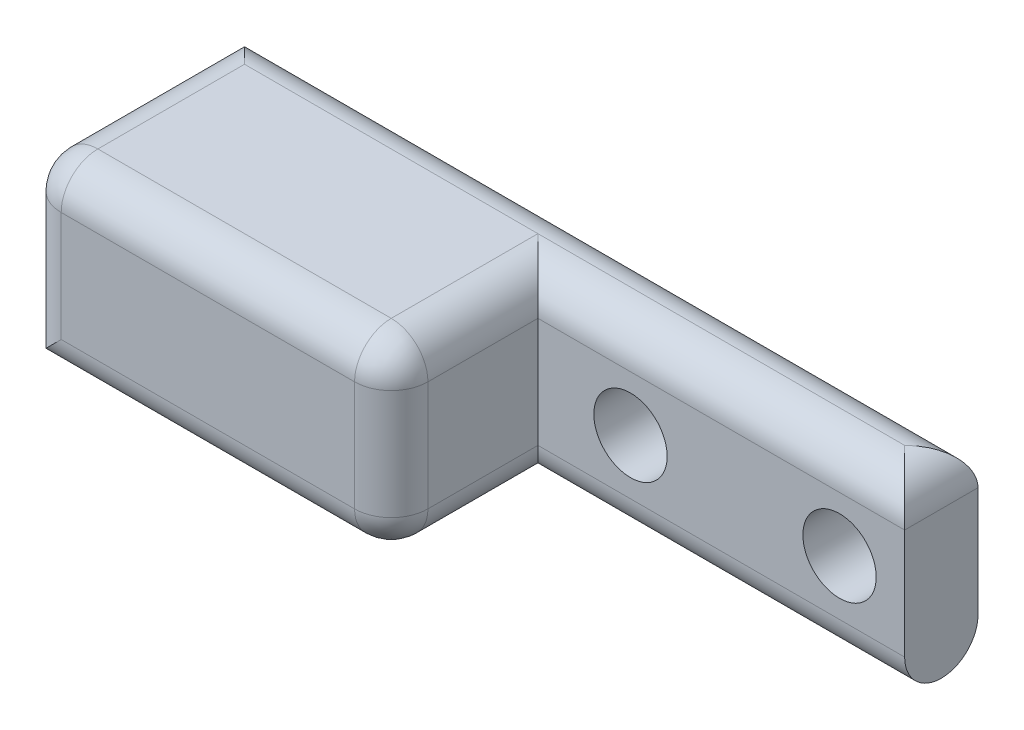
ISO-10303-21;
HEADER;
FILE_DESCRIPTION(('STEP AP214'),'2;1');
FILE_NAME('part.step','',(''),(''),'','','');
FILE_SCHEMA(('AUTOMOTIVE_DESIGN { 1 0 10303 214 1 1 1 1 }'));
ENDSEC;
DATA;
#1=APPLICATION_CONTEXT('core data for automotive mechanical design processes');
#2=APPLICATION_PROTOCOL_DEFINITION('international standard','automotive_design',2000,#1);
#3=PRODUCT_CONTEXT('',#1,'mechanical');
#4=PRODUCT('Part','Part','',(#3));
#5=PRODUCT_RELATED_PRODUCT_CATEGORY('part','',(#4));
#6=PRODUCT_DEFINITION_FORMATION('','',#4);
#7=PRODUCT_DEFINITION_CONTEXT('part definition',#1,'design');
#8=PRODUCT_DEFINITION('design','',#6,#7);
#9=PRODUCT_DEFINITION_SHAPE('','',#8);
#10=(LENGTH_UNIT() NAMED_UNIT(*) SI_UNIT(.MILLI.,.METRE.));
#11=(NAMED_UNIT(*) PLANE_ANGLE_UNIT() SI_UNIT($,.RADIAN.));
#12=(NAMED_UNIT(*) SI_UNIT($,.STERADIAN.) SOLID_ANGLE_UNIT());
#13=UNCERTAINTY_MEASURE_WITH_UNIT(LENGTH_MEASURE(1.E-05),#10,'distance_accuracy_value','');
#14=(GEOMETRIC_REPRESENTATION_CONTEXT(3) GLOBAL_UNCERTAINTY_ASSIGNED_CONTEXT((#13)) GLOBAL_UNIT_ASSIGNED_CONTEXT((#10,
#11,#12)) REPRESENTATION_CONTEXT('',''));
#15=CARTESIAN_POINT('',(0.,0.,0.));
#16=DIRECTION('',(0.,0.,1.));
#17=DIRECTION('',(1.,0.,0.));
#18=AXIS2_PLACEMENT_3D('',#15,#16,#17);
#19=CARTESIAN_POINT('',(10.,5.,0.));
#20=DIRECTION('',(0.,0.,-1.));
#21=DIRECTION('',(-1.,0.,0.));
#22=AXIS2_PLACEMENT_3D('',#19,#20,#21);
#23=PLANE('',#22);
#24=DIRECTION('',(0.,-1.,0.));
#25=VECTOR('',#24,1.);
#26=CARTESIAN_POINT('',(9.,5.,0.));
#27=LINE('',#26,#25);
#28=CARTESIAN_POINT('',(9.,1.,0.));
#29=VERTEX_POINT('',#28);
#30=CARTESIAN_POINT('',(9.,4.,0.));
#31=VERTEX_POINT('',#30);
#32=EDGE_CURVE('E300',#29,#31,#27,.F.);
#33=ORIENTED_EDGE('',*,*,#32,.T.);
#34=DIRECTION('',(1.,0.,0.));
#35=VECTOR('',#34,1.);
#36=CARTESIAN_POINT('',(10.,4.,0.));
#37=LINE('',#36,#35);
#38=CARTESIAN_POINT('',(0.999999999999999,4.,0.));
#39=VERTEX_POINT('',#38);
#40=EDGE_CURVE('E306',#31,#39,#37,.F.);
#41=ORIENTED_EDGE('',*,*,#40,.T.);
#42=DIRECTION('',(0.,-1.,0.));
#43=VECTOR('',#42,1.);
#44=CARTESIAN_POINT('',(0.999999999999999,5.,0.));
#45=LINE('',#44,#43);
#46=CARTESIAN_POINT('',(0.999999999999999,1.,0.));
#47=VERTEX_POINT('',#46);
#48=EDGE_CURVE('E303',#39,#47,#45,.T.);
#49=ORIENTED_EDGE('',*,*,#48,.T.);
#50=DIRECTION('',(1.,0.,0.));
#51=VECTOR('',#50,1.);
#52=CARTESIAN_POINT('',(10.,1.,0.));
#53=LINE('',#52,#51);
#54=EDGE_CURVE('E297',#47,#29,#53,.T.);
#55=ORIENTED_EDGE('',*,*,#54,.T.);
#56=EDGE_LOOP('',(#33,#41,#49,#55));
#57=FACE_BOUND('',#56,.T.);
#58=ADVANCED_FACE('F39',(#57),#23,.F.);
#59=CARTESIAN_POINT('',(10.,5.,-4.));
#60=DIRECTION('',(-1.,0.,0.));
#61=DIRECTION('',(0.,0.,1.));
#62=AXIS2_PLACEMENT_3D('',#59,#60,#61);
#63=PLANE('',#62);
#64=DIRECTION('',(0.,-1.,0.));
#65=VECTOR('',#64,1.);
#66=CARTESIAN_POINT('',(10.,5.,-4.));
#67=LINE('',#66,#65);
#68=CARTESIAN_POINT('',(10.,4.,-4.));
#69=VERTEX_POINT('',#68);
#70=CARTESIAN_POINT('',(10.,1.,-4.));
#71=VERTEX_POINT('',#70);
#72=EDGE_CURVE('E237',#69,#71,#67,.T.);
#73=ORIENTED_EDGE('',*,*,#72,.F.);
#74=DIRECTION('',(0.,0.,-1.));
#75=VECTOR('',#74,1.);
#76=CARTESIAN_POINT('',(10.,4.,-4.));
#77=LINE('',#76,#75);
#78=CARTESIAN_POINT('',(10.,4.,-0.999999999999999));
#79=VERTEX_POINT('',#78);
#80=EDGE_CURVE('E294',#69,#79,#77,.F.);
#81=ORIENTED_EDGE('',*,*,#80,.T.);
#82=DIRECTION('',(0.,-1.,0.));
#83=VECTOR('',#82,1.);
#84=CARTESIAN_POINT('',(10.,5.,-0.999999999999999));
#85=LINE('',#84,#83);
#86=CARTESIAN_POINT('',(10.,1.,-0.999999999999999));
#87=VERTEX_POINT('',#86);
#88=EDGE_CURVE('E291',#79,#87,#85,.T.);
#89=ORIENTED_EDGE('',*,*,#88,.T.);
#90=DIRECTION('',(0.,0.,-1.));
#91=VECTOR('',#90,1.);
#92=CARTESIAN_POINT('',(10.,1.,-4.));
#93=LINE('',#92,#91);
#94=EDGE_CURVE('E288',#87,#71,#93,.T.);
#95=ORIENTED_EDGE('',*,*,#94,.T.);
#96=EDGE_LOOP('',(#73,#81,#89,#95));
#97=FACE_BOUND('',#96,.T.);
#98=ADVANCED_FACE('F374',(#97),#63,.F.);
#99=CARTESIAN_POINT('',(10.,5.,-4.));
#100=DIRECTION('',(0.,0.,-1.));
#101=DIRECTION('',(-1.,0.,0.));
#102=AXIS2_PLACEMENT_3D('',#99,#100,#101);
#103=PLANE('',#102);
#104=CARTESIAN_POINT('',(12.523987240769,2.5,-4.));
#105=DIRECTION('',(0.,0.,1.));
#106=DIRECTION('',(1.,0.,0.));
#107=AXIS2_PLACEMENT_3D('',#104,#105,#106);
#108=CIRCLE('',#107,1.);
#109=CARTESIAN_POINT('',(13.523987240769,2.5,-4.));
#110=VERTEX_POINT('',#109);
#111=EDGE_CURVE('E211',#110,#110,#108,.T.);
#112=ORIENTED_EDGE('',*,*,#111,.F.);
#113=EDGE_LOOP('',(#112));
#114=FACE_BOUND('',#113,.T.);
#115=CARTESIAN_POINT('',(18.223987240769,2.5,-4.));
#116=DIRECTION('',(0.,0.,1.));
#117=DIRECTION('',(1.,0.,0.));
#118=AXIS2_PLACEMENT_3D('',#115,#116,#117);
#119=CIRCLE('',#118,1.);
#120=CARTESIAN_POINT('',(19.223987240769,2.5,-4.));
#121=VERTEX_POINT('',#120);
#122=EDGE_CURVE('E206',#121,#121,#119,.T.);
#123=ORIENTED_EDGE('',*,*,#122,.F.);
#124=EDGE_LOOP('',(#123));
#125=FACE_BOUND('',#124,.T.);
#126=DIRECTION('',(0.,-1.,0.));
#127=VECTOR('',#126,1.);
#128=CARTESIAN_POINT('',(20.,5.,-4.));
#129=LINE('',#128,#127);
#130=CARTESIAN_POINT('',(20.,4.,-4.));
#131=VERTEX_POINT('',#130);
#132=CARTESIAN_POINT('',(20.,1.,-4.));
#133=VERTEX_POINT('',#132);
#134=EDGE_CURVE('E233',#131,#133,#129,.T.);
#135=ORIENTED_EDGE('',*,*,#134,.F.);
#136=DIRECTION('',(1.,0.,0.));
#137=VECTOR('',#136,1.);
#138=CARTESIAN_POINT('',(10.,4.,-4.));
#139=LINE('',#138,#137);
#140=EDGE_CURVE('E143',#131,#69,#139,.F.);
#141=ORIENTED_EDGE('',*,*,#140,.T.);
#142=ORIENTED_EDGE('',*,*,#72,.T.);
#143=DIRECTION('',(1.,0.,0.));
#144=VECTOR('',#143,1.);
#145=CARTESIAN_POINT('',(20.,1.,-4.));
#146=LINE('',#145,#144);
#147=EDGE_CURVE('E283',#71,#133,#146,.T.);
#148=ORIENTED_EDGE('',*,*,#147,.T.);
#149=EDGE_LOOP('',(#135,#141,#142,#148));
#150=FACE_BOUND('',#149,.T.);
#151=ADVANCED_FACE('F378',(#114,#125,#150),#103,.F.);
#152=CARTESIAN_POINT('',(20.,5.,-6.));
#153=DIRECTION('',(-1.,0.,0.));
#154=DIRECTION('',(0.,0.,1.));
#155=AXIS2_PLACEMENT_3D('',#152,#153,#154);
#156=PLANE('',#155);
#157=DIRECTION('',(0.,-1.,0.));
#158=VECTOR('',#157,1.);
#159=CARTESIAN_POINT('',(20.,5.,-6.));
#160=LINE('',#159,#158);
#161=CARTESIAN_POINT('',(20.,4.,-6.));
#162=VERTEX_POINT('',#161);
#163=CARTESIAN_POINT('',(20.,1.,-6.));
#164=VERTEX_POINT('',#163);
#165=EDGE_CURVE('E229',#162,#164,#160,.T.);
#166=ORIENTED_EDGE('',*,*,#165,.F.);
#167=DIRECTION('',(0.,0.,-1.));
#168=VECTOR('',#167,1.);
#169=CARTESIAN_POINT('',(20.,4.,-6.));
#170=LINE('',#169,#168);
#171=EDGE_CURVE('E153',#162,#131,#170,.F.);
#172=ORIENTED_EDGE('',*,*,#171,.T.);
#173=ORIENTED_EDGE('',*,*,#134,.T.);
#174=CARTESIAN_POINT('',(20.,1.,-5.));
#175=DIRECTION('',(-1.,0.,0.));
#176=DIRECTION('',(0.,0.,1.));
#177=AXIS2_PLACEMENT_3D('',#174,#175,#176);
#178=CIRCLE('',#177,1.);
#179=CARTESIAN_POINT('',(20.,0.,-5.));
#180=VERTEX_POINT('',#179);
#181=EDGE_CURVE('E278',#133,#180,#178,.F.);
#182=ORIENTED_EDGE('',*,*,#181,.T.);
#183=CARTESIAN_POINT('',(20.,1.,-5.));
#184=DIRECTION('',(-1.,0.,0.));
#185=DIRECTION('',(0.,0.,1.));
#186=AXIS2_PLACEMENT_3D('',#183,#184,#185);
#187=CIRCLE('',#186,1.);
#188=EDGE_CURVE('E275',#180,#164,#187,.F.);
#189=ORIENTED_EDGE('',*,*,#188,.T.);
#190=EDGE_LOOP('',(#166,#172,#173,#182,#189));
#191=FACE_BOUND('',#190,.T.);
#192=ADVANCED_FACE('F381',(#191),#156,.F.);
#193=CARTESIAN_POINT('',(0.,5.,-6.));
#194=DIRECTION('',(0.,0.,1.));
#195=DIRECTION('',(1.,0.,0.));
#196=AXIS2_PLACEMENT_3D('',#193,#194,#195);
#197=PLANE('',#196);
#198=CARTESIAN_POINT('',(12.523987240769,2.5,-6.));
#199=DIRECTION('',(0.,0.,1.));
#200=DIRECTION('',(1.,0.,0.));
#201=AXIS2_PLACEMENT_3D('',#198,#199,#200);
#202=CIRCLE('',#201,1.);
#203=CARTESIAN_POINT('',(13.523987240769,2.5,-6.));
#204=VERTEX_POINT('',#203);
#205=EDGE_CURVE('E225',#204,#204,#202,.T.);
#206=ORIENTED_EDGE('',*,*,#205,.T.);
#207=EDGE_LOOP('',(#206));
#208=FACE_BOUND('',#207,.T.);
#209=CARTESIAN_POINT('',(18.223987240769,2.5,-6.));
#210=DIRECTION('',(0.,0.,1.));
#211=DIRECTION('',(1.,0.,0.));
#212=AXIS2_PLACEMENT_3D('',#209,#210,#211);
#213=CIRCLE('',#212,1.);
#214=CARTESIAN_POINT('',(19.223987240769,2.5,-6.));
#215=VERTEX_POINT('',#214);
#216=EDGE_CURVE('E217',#215,#215,#213,.T.);
#217=ORIENTED_EDGE('',*,*,#216,.T.);
#218=EDGE_LOOP('',(#217));
#219=FACE_BOUND('',#218,.T.);
#220=DIRECTION('',(0.,-1.,0.));
#221=VECTOR('',#220,1.);
#222=CARTESIAN_POINT('',(0.,5.,-6.));
#223=LINE('',#222,#221);
#224=CARTESIAN_POINT('',(0.,4.,-6.));
#225=VERTEX_POINT('',#224);
#226=CARTESIAN_POINT('',(0.,1.,-6.));
#227=VERTEX_POINT('',#226);
#228=EDGE_CURVE('E224',#225,#227,#223,.T.);
#229=ORIENTED_EDGE('',*,*,#228,.F.);
#230=DIRECTION('',(-1.,0.,0.));
#231=VECTOR('',#230,1.);
#232=CARTESIAN_POINT('',(0.,4.,-6.));
#233=LINE('',#232,#231);
#234=EDGE_CURVE('E272',#225,#162,#233,.F.);
#235=ORIENTED_EDGE('',*,*,#234,.T.);
#236=ORIENTED_EDGE('',*,*,#165,.T.);
#237=DIRECTION('',(-1.,0.,0.));
#238=VECTOR('',#237,1.);
#239=CARTESIAN_POINT('',(0.,1.,-6.));
#240=LINE('',#239,#238);
#241=EDGE_CURVE('E269',#164,#227,#240,.T.);
#242=ORIENTED_EDGE('',*,*,#241,.T.);
#243=EDGE_LOOP('',(#229,#235,#236,#242));
#244=FACE_BOUND('',#243,.T.);
#245=ADVANCED_FACE('F359',(#208,#219,#244),#197,.F.);
#246=CARTESIAN_POINT('',(0.,5.,0.));
#247=DIRECTION('',(1.,0.,0.));
#248=DIRECTION('',(0.,0.,-1.));
#249=AXIS2_PLACEMENT_3D('',#246,#247,#248);
#250=PLANE('',#249);
#251=DIRECTION('',(0.,-1.,0.));
#252=VECTOR('',#251,1.);
#253=CARTESIAN_POINT('',(0.,5.,-1.));
#254=LINE('',#253,#252);
#255=CARTESIAN_POINT('',(0.,0.,-1.));
#256=VERTEX_POINT('',#255);
#257=CARTESIAN_POINT('',(0.,4.,-1.));
#258=VERTEX_POINT('',#257);
#259=EDGE_CURVE('E262',#256,#258,#254,.F.);
#260=ORIENTED_EDGE('',*,*,#259,.T.);
#261=DIRECTION('',(0.,0.,1.));
#262=VECTOR('',#261,1.);
#263=CARTESIAN_POINT('',(0.,4.,0.));
#264=LINE('',#263,#262);
#265=EDGE_CURVE('E265',#258,#225,#264,.F.);
#266=ORIENTED_EDGE('',*,*,#265,.T.);
#267=ORIENTED_EDGE('',*,*,#228,.T.);
#268=CARTESIAN_POINT('',(0.,1.,-5.));
#269=DIRECTION('',(1.,0.,0.));
#270=DIRECTION('',(0.,0.,-1.));
#271=AXIS2_PLACEMENT_3D('',#268,#269,#270);
#272=CIRCLE('',#271,1.);
#273=CARTESIAN_POINT('',(0.,0.,-5.));
#274=VERTEX_POINT('',#273);
#275=EDGE_CURVE('E259',#227,#274,#272,.F.);
#276=ORIENTED_EDGE('',*,*,#275,.T.);
#277=DIRECTION('',(0.,0.,1.));
#278=VECTOR('',#277,1.);
#279=CARTESIAN_POINT('',(0.,0.,0.));
#280=LINE('',#279,#278);
#281=EDGE_CURVE('E220',#274,#256,#280,.T.);
#282=ORIENTED_EDGE('',*,*,#281,.T.);
#283=EDGE_LOOP('',(#260,#266,#267,#276,#282));
#284=FACE_BOUND('',#283,.T.);
#285=ADVANCED_FACE('F357',(#284),#250,.F.);
#286=CARTESIAN_POINT('',(0.,5.,0.));
#287=DIRECTION('',(0.,-1.,0.));
#288=DIRECTION('',(0.,0.,-1.));
#289=AXIS2_PLACEMENT_3D('',#286,#287,#288);
#290=PLANE('',#289);
#291=DIRECTION('',(-1.,0.,0.));
#292=VECTOR('',#291,1.);
#293=CARTESIAN_POINT('',(0.,5.,-5.));
#294=LINE('',#293,#292);
#295=CARTESIAN_POINT('',(9.,5.,-5.));
#296=VERTEX_POINT('',#295);
#297=CARTESIAN_POINT('',(1.,5.,-5.));
#298=VERTEX_POINT('',#297);
#299=EDGE_CURVE('E161',#296,#298,#294,.T.);
#300=ORIENTED_EDGE('',*,*,#299,.T.);
#301=DIRECTION('',(0.,0.,1.));
#302=VECTOR('',#301,1.);
#303=CARTESIAN_POINT('',(1.,5.,0.));
#304=LINE('',#303,#302);
#305=CARTESIAN_POINT('',(1.,5.,-1.));
#306=VERTEX_POINT('',#305);
#307=EDGE_CURVE('E255',#298,#306,#304,.T.);
#308=ORIENTED_EDGE('',*,*,#307,.T.);
#309=DIRECTION('',(1.,0.,0.));
#310=VECTOR('',#309,1.);
#311=CARTESIAN_POINT('',(0.,5.,-1.));
#312=LINE('',#311,#310);
#313=CARTESIAN_POINT('',(9.,5.,-0.999999999999999));
#314=VERTEX_POINT('',#313);
#315=EDGE_CURVE('E241',#306,#314,#312,.T.);
#316=ORIENTED_EDGE('',*,*,#315,.T.);
#317=DIRECTION('',(0.,0.,-1.));
#318=VECTOR('',#317,1.);
#319=CARTESIAN_POINT('',(9.,5.,0.));
#320=LINE('',#319,#318);
#321=EDGE_CURVE('E250',#314,#296,#320,.T.);
#322=ORIENTED_EDGE('',*,*,#321,.T.);
#323=EDGE_LOOP('',(#300,#308,#316,#322));
#324=FACE_BOUND('',#323,.T.);
#325=ADVANCED_FACE('F351',(#324),#290,.F.);
#326=CARTESIAN_POINT('',(0.,0.,0.));
#327=DIRECTION('',(0.,-1.,0.));
#328=DIRECTION('',(0.,0.,-1.));
#329=AXIS2_PLACEMENT_3D('',#326,#327,#328);
#330=PLANE('',#329);
#331=ORIENTED_EDGE('',*,*,#281,.F.);
#332=DIRECTION('',(-1.,0.,0.));
#333=VECTOR('',#332,1.);
#334=CARTESIAN_POINT('',(20.,0.,-5.));
#335=LINE('',#334,#333);
#336=CARTESIAN_POINT('',(9.,0.,-5.));
#337=VERTEX_POINT('',#336);
#338=EDGE_CURVE('E11',#274,#337,#335,.F.);
#339=ORIENTED_EDGE('',*,*,#338,.T.);
#340=DIRECTION('',(0.,0.,-1.));
#341=VECTOR('',#340,1.);
#342=CARTESIAN_POINT('',(9.,0.,0.));
#343=LINE('',#342,#341);
#344=CARTESIAN_POINT('',(9.,0.,-0.999999999999999));
#345=VERTEX_POINT('',#344);
#346=EDGE_CURVE('E50',#337,#345,#343,.F.);
#347=ORIENTED_EDGE('',*,*,#346,.T.);
#348=DIRECTION('',(1.,0.,0.));
#349=VECTOR('',#348,1.);
#350=CARTESIAN_POINT('',(0.,0.,-1.));
#351=LINE('',#350,#349);
#352=EDGE_CURVE('E310',#345,#256,#351,.F.);
#353=ORIENTED_EDGE('',*,*,#352,.T.);
#354=EDGE_LOOP('',(#331,#339,#347,#353));
#355=FACE_BOUND('',#354,.T.);
#356=ADVANCED_FACE('F363',(#355),#330,.T.);
#357=CARTESIAN_POINT('',(18.223987240769,2.5,-9.));
#358=DIRECTION('',(0.,0.,1.));
#359=DIRECTION('',(1.,0.,0.));
#360=AXIS2_PLACEMENT_3D('',#357,#358,#359);
#361=CYLINDRICAL_SURFACE('',#360,1.);
#362=ORIENTED_EDGE('',*,*,#122,.T.);
#363=EDGE_LOOP('',(#362));
#364=FACE_BOUND('',#363,.T.);
#365=ORIENTED_EDGE('',*,*,#216,.F.);
#366=EDGE_LOOP('',(#365));
#367=FACE_BOUND('',#366,.T.);
#368=ADVANCED_FACE('F432',(#364,#367),#361,.F.);
#369=CARTESIAN_POINT('',(12.523987240769,2.5,-9.));
#370=DIRECTION('',(0.,0.,1.));
#371=DIRECTION('',(1.,0.,0.));
#372=AXIS2_PLACEMENT_3D('',#369,#370,#371);
#373=CYLINDRICAL_SURFACE('',#372,1.);
#374=ORIENTED_EDGE('',*,*,#111,.T.);
#375=EDGE_LOOP('',(#374));
#376=FACE_BOUND('',#375,.T.);
#377=ORIENTED_EDGE('',*,*,#205,.F.);
#378=EDGE_LOOP('',(#377));
#379=FACE_BOUND('',#378,.T.);
#380=ADVANCED_FACE('F428',(#376,#379),#373,.F.);
#381=CARTESIAN_POINT('',(0.,1.,-5.));
#382=DIRECTION('',(1.,0.,0.));
#383=DIRECTION('',(0.,0.,-1.));
#384=AXIS2_PLACEMENT_3D('',#381,#382,#383);
#385=CYLINDRICAL_SURFACE('',#384,1.);
#386=ORIENTED_EDGE('',*,*,#241,.F.);
#387=ORIENTED_EDGE('',*,*,#188,.F.);
#388=DIRECTION('',(-1.,0.,0.));
#389=VECTOR('',#388,1.);
#390=CARTESIAN_POINT('',(20.,0.,-5.));
#391=LINE('',#390,#389);
#392=EDGE_CURVE('E43',#337,#180,#391,.F.);
#393=ORIENTED_EDGE('',*,*,#392,.F.);
#394=ORIENTED_EDGE('',*,*,#338,.F.);
#395=ORIENTED_EDGE('',*,*,#275,.F.);
#396=EDGE_LOOP('',(#386,#387,#393,#394,#395));
#397=FACE_BOUND('',#396,.T.);
#398=ADVANCED_FACE('F41',(#397),#385,.T.);
#399=CARTESIAN_POINT('',(10.,1.,-5.));
#400=DIRECTION('',(-1.,0.,0.));
#401=DIRECTION('',(0.,0.,1.));
#402=AXIS2_PLACEMENT_3D('',#399,#400,#401);
#403=CYLINDRICAL_SURFACE('',#402,1.);
#404=ORIENTED_EDGE('',*,*,#181,.F.);
#405=ORIENTED_EDGE('',*,*,#147,.F.);
#406=CARTESIAN_POINT('',(9.,1.,-5.));
#407=DIRECTION('',(-0.707106781186547,0.,0.707106781186547));
#408=DIRECTION('',(-0.707106781186547,0.,-0.707106781186547));
#409=AXIS2_PLACEMENT_3D('',#406,#407,#408);
#410=ELLIPSE('',#409,1.41421356237309,1.);
#411=EDGE_CURVE('E197',#337,#71,#410,.T.);
#412=ORIENTED_EDGE('',*,*,#411,.F.);
#413=ORIENTED_EDGE('',*,*,#392,.T.);
#414=EDGE_LOOP('',(#404,#405,#412,#413));
#415=FACE_BOUND('',#414,.T.);
#416=ADVANCED_FACE('F379',(#415),#403,.T.);
#417=CARTESIAN_POINT('',(9.,1.,-4.));
#418=DIRECTION('',(0.,0.,1.));
#419=DIRECTION('',(1.,0.,0.));
#420=AXIS2_PLACEMENT_3D('',#417,#418,#419);
#421=CYLINDRICAL_SURFACE('',#420,1.);
#422=ORIENTED_EDGE('',*,*,#411,.T.);
#423=ORIENTED_EDGE('',*,*,#94,.F.);
#424=CARTESIAN_POINT('',(9.,1.,-0.999999999999999));
#425=DIRECTION('',(0.,0.,1.));
#426=DIRECTION('',(1.,0.,0.));
#427=AXIS2_PLACEMENT_3D('',#424,#425,#426);
#428=CIRCLE('',#427,1.);
#429=EDGE_CURVE('E190',#345,#87,#428,.T.);
#430=ORIENTED_EDGE('',*,*,#429,.F.);
#431=ORIENTED_EDGE('',*,*,#346,.F.);
#432=EDGE_LOOP('',(#422,#423,#430,#431));
#433=FACE_BOUND('',#432,.T.);
#434=ADVANCED_FACE('F371',(#433),#421,.T.);
#435=CARTESIAN_POINT('',(9.,5.,-0.999999999999999));
#436=DIRECTION('',(0.,-1.,0.));
#437=DIRECTION('',(0.,0.,-1.));
#438=AXIS2_PLACEMENT_3D('',#435,#436,#437);
#439=CYLINDRICAL_SURFACE('',#438,1.);
#440=CARTESIAN_POINT('',(9.,1.,-0.999999999999999));
#441=DIRECTION('',(0.,-1.,0.));
#442=DIRECTION('',(0.,0.,-1.));
#443=AXIS2_PLACEMENT_3D('',#440,#441,#442);
#444=CIRCLE('',#443,1.);
#445=EDGE_CURVE('E194',#87,#29,#444,.T.);
#446=ORIENTED_EDGE('',*,*,#445,.F.);
#447=ORIENTED_EDGE('',*,*,#88,.F.);
#448=CARTESIAN_POINT('',(9.,4.,-0.999999999999999));
#449=DIRECTION('',(0.,1.,0.));
#450=DIRECTION('',(0.,0.,1.));
#451=AXIS2_PLACEMENT_3D('',#448,#449,#450);
#452=CIRCLE('',#451,1.);
#453=EDGE_CURVE('E182',#31,#79,#452,.T.);
#454=ORIENTED_EDGE('',*,*,#453,.F.);
#455=ORIENTED_EDGE('',*,*,#32,.F.);
#456=EDGE_LOOP('',(#446,#447,#454,#455));
#457=FACE_BOUND('',#456,.T.);
#458=ADVANCED_FACE('F341',(#457),#439,.T.);
#459=CARTESIAN_POINT('',(9.,1.,-0.999999999999999));
#460=DIRECTION('',(1.,0.,0.));
#461=DIRECTION('',(0.,0.,-1.));
#462=AXIS2_PLACEMENT_3D('',#459,#460,#461);
#463=SPHERICAL_SURFACE('',#462,1.);
#464=ORIENTED_EDGE('',*,*,#429,.T.);
#465=ORIENTED_EDGE('',*,*,#445,.T.);
#466=CARTESIAN_POINT('',(9.,1.,-0.999999999999999));
#467=DIRECTION('',(1.,0.,0.));
#468=DIRECTION('',(0.,0.,-1.));
#469=AXIS2_PLACEMENT_3D('',#466,#467,#468);
#470=CIRCLE('',#469,1.);
#471=EDGE_CURVE('E147',#345,#29,#470,.F.);
#472=ORIENTED_EDGE('',*,*,#471,.F.);
#473=EDGE_LOOP('',(#464,#465,#472));
#474=FACE_BOUND('',#473,.T.);
#475=ADVANCED_FACE('F370',(#474),#463,.T.);
#476=CARTESIAN_POINT('',(9.,4.,0.));
#477=DIRECTION('',(0.,0.,-1.));
#478=DIRECTION('',(-1.,0.,0.));
#479=AXIS2_PLACEMENT_3D('',#476,#477,#478);
#480=CYLINDRICAL_SURFACE('',#479,1.);
#481=CARTESIAN_POINT('',(9.,4.,-0.999999999999999));
#482=DIRECTION('',(0.,0.,1.));
#483=DIRECTION('',(1.,0.,0.));
#484=AXIS2_PLACEMENT_3D('',#481,#482,#483);
#485=CIRCLE('',#484,1.);
#486=EDGE_CURVE('E186',#79,#314,#485,.T.);
#487=ORIENTED_EDGE('',*,*,#486,.F.);
#488=ORIENTED_EDGE('',*,*,#80,.F.);
#489=CARTESIAN_POINT('',(9.,4.,-5.));
#490=DIRECTION('',(0.707106781186547,0.,-0.707106781186547));
#491=DIRECTION('',(0.707106781186547,0.,0.707106781186547));
#492=AXIS2_PLACEMENT_3D('',#489,#490,#491);
#493=ELLIPSE('',#492,1.41421356237309,1.);
#494=EDGE_CURVE('E148',#296,#69,#493,.T.);
#495=ORIENTED_EDGE('',*,*,#494,.F.);
#496=ORIENTED_EDGE('',*,*,#321,.F.);
#497=EDGE_LOOP('',(#487,#488,#495,#496));
#498=FACE_BOUND('',#497,.T.);
#499=ADVANCED_FACE('F348',(#498),#480,.T.);
#500=CARTESIAN_POINT('',(9.,4.,-0.999999999999999));
#501=DIRECTION('',(1.,0.,0.));
#502=DIRECTION('',(0.,0.,-1.));
#503=AXIS2_PLACEMENT_3D('',#500,#501,#502);
#504=SPHERICAL_SURFACE('',#503,1.);
#505=ORIENTED_EDGE('',*,*,#453,.T.);
#506=ORIENTED_EDGE('',*,*,#486,.T.);
#507=CARTESIAN_POINT('',(9.,4.,-0.999999999999999));
#508=DIRECTION('',(1.,0.,0.));
#509=DIRECTION('',(0.,0.,-1.));
#510=AXIS2_PLACEMENT_3D('',#507,#508,#509);
#511=CIRCLE('',#510,1.);
#512=EDGE_CURVE('E173',#31,#314,#511,.F.);
#513=ORIENTED_EDGE('',*,*,#512,.F.);
#514=EDGE_LOOP('',(#505,#506,#513));
#515=FACE_BOUND('',#514,.T.);
#516=ADVANCED_FACE('F344',(#515),#504,.T.);
#517=CARTESIAN_POINT('',(10.,1.,-0.999999999999999));
#518=DIRECTION('',(-1.,0.,0.));
#519=DIRECTION('',(0.,0.,1.));
#520=AXIS2_PLACEMENT_3D('',#517,#518,#519);
#521=CYLINDRICAL_SURFACE('',#520,1.);
#522=ORIENTED_EDGE('',*,*,#471,.T.);
#523=ORIENTED_EDGE('',*,*,#54,.F.);
#524=CARTESIAN_POINT('',(0.999999999999999,1.,-1.));
#525=DIRECTION('',(-0.707106781186547,0.707106781186547,0.));
#526=DIRECTION('',(-0.707106781186547,-0.707106781186547,0.));
#527=AXIS2_PLACEMENT_3D('',#524,#525,#526);
#528=ELLIPSE('',#527,1.41421356237309,1.);
#529=EDGE_CURVE('E157',#256,#47,#528,.T.);
#530=ORIENTED_EDGE('',*,*,#529,.F.);
#531=ORIENTED_EDGE('',*,*,#352,.F.);
#532=EDGE_LOOP('',(#522,#523,#530,#531));
#533=FACE_BOUND('',#532,.T.);
#534=ADVANCED_FACE('F367',(#533),#521,.T.);
#535=CARTESIAN_POINT('',(19.,4.,0.));
#536=DIRECTION('',(0.,0.,-1.));
#537=DIRECTION('',(-1.,0.,0.));
#538=AXIS2_PLACEMENT_3D('',#535,#536,#537);
#539=CYLINDRICAL_SURFACE('',#538,1.);
#540=CARTESIAN_POINT('',(19.,4.,-5.));
#541=DIRECTION('',(0.707106781186547,0.,-0.707106781186547));
#542=DIRECTION('',(0.707106781186547,0.,0.707106781186547));
#543=AXIS2_PLACEMENT_3D('',#540,#541,#542);
#544=ELLIPSE('',#543,1.41421356237309,1.);
#545=CARTESIAN_POINT('',(19.,5.,-5.));
#546=VERTEX_POINT('',#545);
#547=EDGE_CURVE('E136',#131,#546,#544,.F.);
#548=ORIENTED_EDGE('',*,*,#547,.F.);
#549=ORIENTED_EDGE('',*,*,#171,.F.);
#550=CARTESIAN_POINT('',(19.,4.,-5.));
#551=DIRECTION('',(-0.707106781186547,0.,-0.707106781186547));
#552=DIRECTION('',(0.707106781186547,0.,-0.707106781186547));
#553=AXIS2_PLACEMENT_3D('',#550,#551,#552);
#554=ELLIPSE('',#553,1.41421356237309,1.);
#555=EDGE_CURVE('E151',#546,#162,#554,.T.);
#556=ORIENTED_EDGE('',*,*,#555,.F.);
#557=EDGE_LOOP('',(#548,#549,#556));
#558=FACE_BOUND('',#557,.T.);
#559=ADVANCED_FACE('F152',(#558),#539,.T.);
#560=CARTESIAN_POINT('',(0.,4.,-5.));
#561=DIRECTION('',(1.,0.,0.));
#562=DIRECTION('',(0.,0.,-1.));
#563=AXIS2_PLACEMENT_3D('',#560,#561,#562);
#564=CYLINDRICAL_SURFACE('',#563,1.);
#565=ORIENTED_EDGE('',*,*,#140,.F.);
#566=ORIENTED_EDGE('',*,*,#547,.T.);
#567=DIRECTION('',(1.,0.,0.));
#568=VECTOR('',#567,1.);
#569=CARTESIAN_POINT('',(0.,5.,-5.));
#570=LINE('',#569,#568);
#571=EDGE_CURVE('E141',#296,#546,#570,.T.);
#572=ORIENTED_EDGE('',*,*,#571,.F.);
#573=ORIENTED_EDGE('',*,*,#494,.T.);
#574=EDGE_LOOP('',(#565,#566,#572,#573));
#575=FACE_BOUND('',#574,.T.);
#576=ADVANCED_FACE('F138',(#575),#564,.T.);
#577=CARTESIAN_POINT('',(0.,4.,-1.));
#578=DIRECTION('',(1.,0.,0.));
#579=DIRECTION('',(0.,0.,-1.));
#580=AXIS2_PLACEMENT_3D('',#577,#578,#579);
#581=CYLINDRICAL_SURFACE('',#580,1.);
#582=ORIENTED_EDGE('',*,*,#512,.T.);
#583=ORIENTED_EDGE('',*,*,#315,.F.);
#584=CARTESIAN_POINT('',(0.999999999999999,4.,-1.));
#585=DIRECTION('',(-1.,0.,0.));
#586=DIRECTION('',(0.,-1.,0.));
#587=AXIS2_PLACEMENT_3D('',#584,#585,#586);
#588=CIRCLE('',#587,1.);
#589=EDGE_CURVE('E163',#39,#306,#588,.T.);
#590=ORIENTED_EDGE('',*,*,#589,.F.);
#591=ORIENTED_EDGE('',*,*,#40,.F.);
#592=EDGE_LOOP('',(#582,#583,#590,#591));
#593=FACE_BOUND('',#592,.T.);
#594=ADVANCED_FACE('F330',(#593),#581,.T.);
#595=CARTESIAN_POINT('',(0.999999999999999,5.,-1.));
#596=DIRECTION('',(0.,-1.,0.));
#597=DIRECTION('',(0.,0.,-1.));
#598=AXIS2_PLACEMENT_3D('',#595,#596,#597);
#599=CYLINDRICAL_SURFACE('',#598,1.);
#600=ORIENTED_EDGE('',*,*,#529,.T.);
#601=ORIENTED_EDGE('',*,*,#48,.F.);
#602=CARTESIAN_POINT('',(1.,4.,-1.));
#603=DIRECTION('',(0.,1.,0.));
#604=DIRECTION('',(0.,0.,1.));
#605=AXIS2_PLACEMENT_3D('',#602,#603,#604);
#606=CIRCLE('',#605,1.);
#607=EDGE_CURVE('E166',#258,#39,#606,.T.);
#608=ORIENTED_EDGE('',*,*,#607,.F.);
#609=ORIENTED_EDGE('',*,*,#259,.F.);
#610=EDGE_LOOP('',(#600,#601,#608,#609));
#611=FACE_BOUND('',#610,.T.);
#612=ADVANCED_FACE('F331',(#611),#599,.T.);
#613=CARTESIAN_POINT('',(0.,4.,-5.));
#614=DIRECTION('',(-1.,0.,0.));
#615=DIRECTION('',(0.,0.,1.));
#616=AXIS2_PLACEMENT_3D('',#613,#614,#615);
#617=CYLINDRICAL_SURFACE('',#616,1.);
#618=ORIENTED_EDGE('',*,*,#555,.T.);
#619=ORIENTED_EDGE('',*,*,#234,.F.);
#620=CARTESIAN_POINT('',(1.,4.,-5.));
#621=DIRECTION('',(-0.707106781186547,0.,0.707106781186547));
#622=DIRECTION('',(-0.707106781186547,0.,-0.707106781186547));
#623=AXIS2_PLACEMENT_3D('',#620,#621,#622);
#624=ELLIPSE('',#623,1.41421356237309,1.);
#625=EDGE_CURVE('E317',#298,#225,#624,.T.);
#626=ORIENTED_EDGE('',*,*,#625,.F.);
#627=ORIENTED_EDGE('',*,*,#299,.F.);
#628=ORIENTED_EDGE('',*,*,#571,.T.);
#629=EDGE_LOOP('',(#618,#619,#626,#627,#628));
#630=FACE_BOUND('',#629,.T.);
#631=ADVANCED_FACE('F159',(#630),#617,.T.);
#632=CARTESIAN_POINT('',(1.,4.,-1.));
#633=DIRECTION('',(0.,0.,1.));
#634=DIRECTION('',(1.,0.,0.));
#635=AXIS2_PLACEMENT_3D('',#632,#633,#634);
#636=SPHERICAL_SURFACE('',#635,1.);
#637=ORIENTED_EDGE('',*,*,#607,.T.);
#638=ORIENTED_EDGE('',*,*,#589,.T.);
#639=CARTESIAN_POINT('',(1.,4.,-1.));
#640=DIRECTION('',(0.,0.,1.));
#641=DIRECTION('',(1.,0.,0.));
#642=AXIS2_PLACEMENT_3D('',#639,#640,#641);
#643=CIRCLE('',#642,1.);
#644=EDGE_CURVE('E129',#258,#306,#643,.F.);
#645=ORIENTED_EDGE('',*,*,#644,.F.);
#646=EDGE_LOOP('',(#637,#638,#645));
#647=FACE_BOUND('',#646,.T.);
#648=ADVANCED_FACE('F323',(#647),#636,.T.);
#649=CARTESIAN_POINT('',(1.,4.,0.));
#650=DIRECTION('',(0.,0.,1.));
#651=DIRECTION('',(1.,0.,0.));
#652=AXIS2_PLACEMENT_3D('',#649,#650,#651);
#653=CYLINDRICAL_SURFACE('',#652,1.);
#654=ORIENTED_EDGE('',*,*,#625,.T.);
#655=ORIENTED_EDGE('',*,*,#265,.F.);
#656=ORIENTED_EDGE('',*,*,#644,.T.);
#657=ORIENTED_EDGE('',*,*,#307,.F.);
#658=EDGE_LOOP('',(#654,#655,#656,#657));
#659=FACE_BOUND('',#658,.T.);
#660=ADVANCED_FACE('F352',(#659),#653,.T.);
#661=CLOSED_SHELL('',(#58,#98,#151,#192,#245,#285,#325,#356,#368,#380,#398,#416,#434,#458,#475,
#499,#516,#534,#559,#576,#594,#612,#631,#648,#660));
#662=MANIFOLD_SOLID_BREP('B2',#661);
#663=ADVANCED_BREP_SHAPE_REPRESENTATION('',(#18,#662),#14);
#664=SHAPE_DEFINITION_REPRESENTATION(#9,#663);
ENDSEC;
END-ISO-10303-21;
